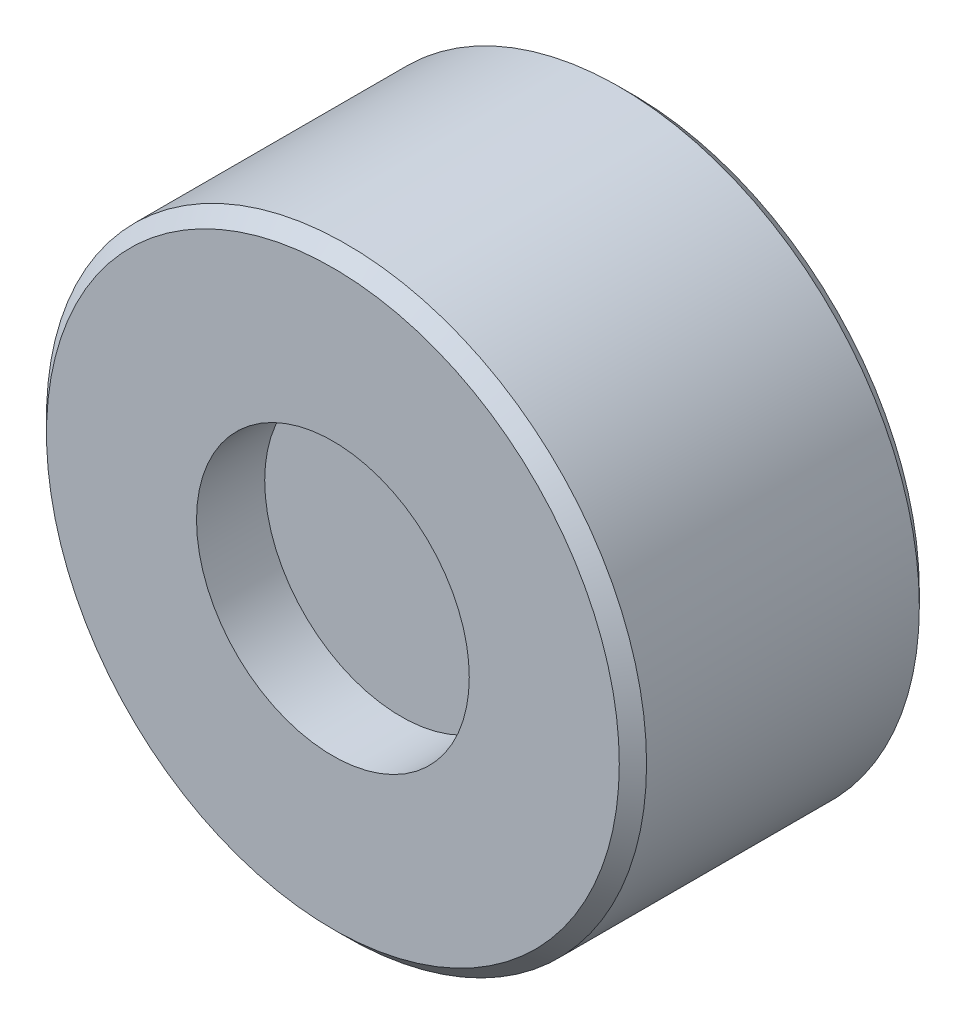
ISO-10303-21;
HEADER;
FILE_DESCRIPTION(('STEP AP214'),'2;1');
FILE_NAME('part.step','',(''),(''),'','','');
FILE_SCHEMA(('AUTOMOTIVE_DESIGN { 1 0 10303 214 1 1 1 1 }'));
ENDSEC;
DATA;
#1=APPLICATION_CONTEXT('core data for automotive mechanical design processes');
#2=APPLICATION_PROTOCOL_DEFINITION('international standard','automotive_design',2000,#1);
#3=PRODUCT_CONTEXT('',#1,'mechanical');
#4=PRODUCT('Part','Part','',(#3));
#5=PRODUCT_RELATED_PRODUCT_CATEGORY('part','',(#4));
#6=PRODUCT_DEFINITION_FORMATION('','',#4);
#7=PRODUCT_DEFINITION_CONTEXT('part definition',#1,'design');
#8=PRODUCT_DEFINITION('design','',#6,#7);
#9=PRODUCT_DEFINITION_SHAPE('','',#8);
#10=(LENGTH_UNIT() NAMED_UNIT(*) SI_UNIT(.MILLI.,.METRE.));
#11=(NAMED_UNIT(*) PLANE_ANGLE_UNIT() SI_UNIT($,.RADIAN.));
#12=(NAMED_UNIT(*) SI_UNIT($,.STERADIAN.) SOLID_ANGLE_UNIT());
#13=UNCERTAINTY_MEASURE_WITH_UNIT(LENGTH_MEASURE(1.E-05),#10,'distance_accuracy_value','');
#14=(GEOMETRIC_REPRESENTATION_CONTEXT(3) GLOBAL_UNCERTAINTY_ASSIGNED_CONTEXT((#13)) GLOBAL_UNIT_ASSIGNED_CONTEXT((#10,
#11,#12)) REPRESENTATION_CONTEXT('',''));
#15=CARTESIAN_POINT('',(0.,0.,0.));
#16=DIRECTION('',(0.,0.,1.));
#17=DIRECTION('',(1.,0.,0.));
#18=AXIS2_PLACEMENT_3D('',#15,#16,#17);
#19=CARTESIAN_POINT('',(0.,0.,22.));
#20=DIRECTION('',(0.,0.,-1.));
#21=DIRECTION('',(-1.,0.,0.));
#22=AXIS2_PLACEMENT_3D('',#19,#20,#21);
#23=CYLINDRICAL_SURFACE('',#22,22.);
#24=CARTESIAN_POINT('',(0.,0.,21.));
#25=DIRECTION('',(0.,0.,1.));
#26=DIRECTION('',(1.,0.,0.));
#27=AXIS2_PLACEMENT_3D('',#24,#25,#26);
#28=CIRCLE('',#27,22.);
#29=CARTESIAN_POINT('',(22.,0.,21.));
#30=VERTEX_POINT('',#29);
#31=EDGE_CURVE('E45',#30,#30,#28,.F.);
#32=ORIENTED_EDGE('',*,*,#31,.T.);
#33=EDGE_LOOP('',(#32));
#34=FACE_BOUND('',#33,.T.);
#35=CARTESIAN_POINT('',(0.,0.,0.999999999999994));
#36=DIRECTION('',(0.,0.,1.));
#37=DIRECTION('',(1.,0.,0.));
#38=AXIS2_PLACEMENT_3D('',#35,#36,#37);
#39=CIRCLE('',#38,22.);
#40=CARTESIAN_POINT('',(22.,0.,0.999999999999994));
#41=VERTEX_POINT('',#40);
#42=EDGE_CURVE('E50',#41,#41,#39,.T.);
#43=ORIENTED_EDGE('',*,*,#42,.T.);
#44=EDGE_LOOP('',(#43));
#45=FACE_BOUND('',#44,.T.);
#46=ADVANCED_FACE('F30',(#34,#45),#23,.T.);
#47=CARTESIAN_POINT('',(0.,0.,22.));
#48=DIRECTION('',(0.,0.,1.));
#49=DIRECTION('',(1.,0.,0.));
#50=AXIS2_PLACEMENT_3D('',#47,#48,#49);
#51=PLANE('',#50);
#52=CARTESIAN_POINT('',(0.,0.,22.));
#53=DIRECTION('',(0.,0.,1.));
#54=DIRECTION('',(1.,0.,0.));
#55=AXIS2_PLACEMENT_3D('',#52,#53,#54);
#56=CIRCLE('',#55,21.);
#57=CARTESIAN_POINT('',(21.,0.,22.));
#58=VERTEX_POINT('',#57);
#59=EDGE_CURVE('E53',#58,#58,#56,.T.);
#60=ORIENTED_EDGE('',*,*,#59,.T.);
#61=EDGE_LOOP('',(#60));
#62=FACE_BOUND('',#61,.T.);
#63=CARTESIAN_POINT('',(0.,0.,22.));
#64=DIRECTION('',(0.,0.,1.));
#65=DIRECTION('',(1.,0.,0.));
#66=AXIS2_PLACEMENT_3D('',#63,#64,#65);
#67=CIRCLE('',#66,10.);
#68=CARTESIAN_POINT('',(10.,0.,22.));
#69=VERTEX_POINT('',#68);
#70=EDGE_CURVE('E57',#69,#69,#67,.T.);
#71=ORIENTED_EDGE('',*,*,#70,.F.);
#72=EDGE_LOOP('',(#71));
#73=FACE_BOUND('',#72,.T.);
#74=ADVANCED_FACE('F72',(#62,#73),#51,.T.);
#75=CARTESIAN_POINT('',(0.,0.,0.));
#76=DIRECTION('',(0.,0.,1.));
#77=DIRECTION('',(1.,0.,0.));
#78=AXIS2_PLACEMENT_3D('',#75,#76,#77);
#79=PLANE('',#78);
#80=CARTESIAN_POINT('',(0.,18.8183021810615,0.));
#81=DIRECTION('',(0.,0.,-1.));
#82=DIRECTION('',(-1.,0.,0.));
#83=AXIS2_PLACEMENT_3D('',#80,#81,#82);
#84=CIRCLE('',#83,0.911044844025388);
#85=CARTESIAN_POINT('',(-0.911044844025388,18.8183021810615,0.));
#86=VERTEX_POINT('',#85);
#87=EDGE_CURVE('E60',#86,#86,#84,.T.);
#88=ORIENTED_EDGE('',*,*,#87,.F.);
#89=EDGE_LOOP('',(#88));
#90=FACE_BOUND('',#89,.T.);
#91=CARTESIAN_POINT('',(0.,0.,0.));
#92=DIRECTION('',(0.,0.,1.));
#93=DIRECTION('',(1.,0.,0.));
#94=AXIS2_PLACEMENT_3D('',#91,#92,#93);
#95=CIRCLE('',#94,21.);
#96=CARTESIAN_POINT('',(21.,0.,0.));
#97=VERTEX_POINT('',#96);
#98=EDGE_CURVE('E41',#97,#97,#95,.F.);
#99=ORIENTED_EDGE('',*,*,#98,.T.);
#100=EDGE_LOOP('',(#99));
#101=FACE_BOUND('',#100,.T.);
#102=ADVANCED_FACE('F68',(#90,#101),#79,.F.);
#103=CARTESIAN_POINT('',(0.,0.,17.));
#104=DIRECTION('',(0.,0.,1.));
#105=DIRECTION('',(1.,0.,0.));
#106=AXIS2_PLACEMENT_3D('',#103,#104,#105);
#107=CYLINDRICAL_SURFACE('',#106,10.);
#108=CARTESIAN_POINT('',(0.,0.,17.));
#109=DIRECTION('',(0.,0.,1.));
#110=DIRECTION('',(1.,0.,0.));
#111=AXIS2_PLACEMENT_3D('',#108,#109,#110);
#112=CIRCLE('',#111,10.);
#113=CARTESIAN_POINT('',(10.,0.,17.));
#114=VERTEX_POINT('',#113);
#115=EDGE_CURVE('E56',#114,#114,#112,.T.);
#116=ORIENTED_EDGE('',*,*,#115,.F.);
#117=EDGE_LOOP('',(#116));
#118=FACE_BOUND('',#117,.T.);
#119=ORIENTED_EDGE('',*,*,#70,.T.);
#120=EDGE_LOOP('',(#119));
#121=FACE_BOUND('',#120,.T.);
#122=ADVANCED_FACE('F71',(#118,#121),#107,.F.);
#123=CARTESIAN_POINT('',(0.,0.,17.));
#124=DIRECTION('',(0.,0.,1.));
#125=DIRECTION('',(1.,0.,0.));
#126=AXIS2_PLACEMENT_3D('',#123,#124,#125);
#127=PLANE('',#126);
#128=ORIENTED_EDGE('',*,*,#115,.T.);
#129=EDGE_LOOP('',(#128));
#130=FACE_BOUND('',#129,.T.);
#131=ADVANCED_FACE('F92',(#130),#127,.T.);
#132=CARTESIAN_POINT('',(0.,0.,22.));
#133=DIRECTION('',(0.,0.,-1.));
#134=DIRECTION('',(-1.,0.,0.));
#135=AXIS2_PLACEMENT_3D('',#132,#133,#134);
#136=CONICAL_SURFACE('',#135,21.,0.785398163397445);
#137=ORIENTED_EDGE('',*,*,#31,.F.);
#138=EDGE_LOOP('',(#137));
#139=FACE_BOUND('',#138,.T.);
#140=ORIENTED_EDGE('',*,*,#59,.F.);
#141=EDGE_LOOP('',(#140));
#142=FACE_BOUND('',#141,.T.);
#143=ADVANCED_FACE('F79',(#139,#142),#136,.T.);
#144=CARTESIAN_POINT('',(0.,0.,0.999999999999994));
#145=DIRECTION('',(0.,0.,1.));
#146=DIRECTION('',(1.,0.,0.));
#147=AXIS2_PLACEMENT_3D('',#144,#145,#146);
#148=CONICAL_SURFACE('',#147,22.,0.785398163397452);
#149=ORIENTED_EDGE('',*,*,#98,.F.);
#150=EDGE_LOOP('',(#149));
#151=FACE_BOUND('',#150,.T.);
#152=ORIENTED_EDGE('',*,*,#42,.F.);
#153=EDGE_LOOP('',(#152));
#154=FACE_BOUND('',#153,.T.);
#155=ADVANCED_FACE('F76',(#151,#154),#148,.T.);
#156=CARTESIAN_POINT('',(0.,18.8183021810615,1.));
#157=DIRECTION('',(0.,0.,-1.));
#158=DIRECTION('',(-1.,0.,0.));
#159=AXIS2_PLACEMENT_3D('',#156,#157,#158);
#160=CYLINDRICAL_SURFACE('',#159,0.911044844025388);
#161=CARTESIAN_POINT('',(0.,18.8183021810615,0.0999999999999867));
#162=DIRECTION('',(0.,0.,-1.));
#163=DIRECTION('',(-1.,0.,0.));
#164=AXIS2_PLACEMENT_3D('',#161,#162,#163);
#165=CIRCLE('',#164,0.911044844025388);
#166=CARTESIAN_POINT('',(-0.911044844025388,18.8183021810615,0.0999999999999868));
#167=VERTEX_POINT('',#166);
#168=EDGE_CURVE('E10',#167,#167,#165,.F.);
#169=ORIENTED_EDGE('',*,*,#168,.T.);
#170=EDGE_LOOP('',(#169));
#171=FACE_BOUND('',#170,.T.);
#172=ORIENTED_EDGE('',*,*,#87,.T.);
#173=EDGE_LOOP('',(#172));
#174=FACE_BOUND('',#173,.T.);
#175=ADVANCED_FACE('F66',(#171,#174),#160,.F.);
#176=CARTESIAN_POINT('',(0.,18.8183021810615,1.));
#177=DIRECTION('',(0.,0.,-1.));
#178=DIRECTION('',(-1.,0.,0.));
#179=AXIS2_PLACEMENT_3D('',#176,#177,#178);
#180=PLANE('',#179);
#181=CARTESIAN_POINT('',(0.,18.8183021810615,1.));
#182=DIRECTION('',(0.,0.,-1.));
#183=DIRECTION('',(-1.,0.,0.));
#184=AXIS2_PLACEMENT_3D('',#181,#182,#183);
#185=CIRCLE('',#184,0.0110448440253651);
#186=CARTESIAN_POINT('',(-0.011044844025365,18.8183021810615,1.));
#187=VERTEX_POINT('',#186);
#188=EDGE_CURVE('E37',#187,#187,#185,.T.);
#189=ORIENTED_EDGE('',*,*,#188,.T.);
#190=EDGE_LOOP('',(#189));
#191=FACE_BOUND('',#190,.T.);
#192=ADVANCED_FACE('F114',(#191),#180,.T.);
#193=CARTESIAN_POINT('',(0.,18.8183021810615,1.));
#194=DIRECTION('',(0.,0.,-1.));
#195=DIRECTION('',(-1.,0.,0.));
#196=AXIS2_PLACEMENT_3D('',#193,#194,#195);
#197=CONICAL_SURFACE('',#196,0.0110448440253651,0.785398163397454);
#198=CARTESIAN_POINT('',(-0.911044844025388,18.8183021810615,0.0999999999999868));
#199=CARTESIAN_POINT('',(-0.901669844025387,18.8183021810615,0.109374999999987));
#200=CARTESIAN_POINT('',(-0.892294844025387,18.8183021810615,0.118749999999987));
#201=CARTESIAN_POINT('',(-0.873544844025387,18.8183021810615,0.137499999999987));
#202=CARTESIAN_POINT('',(-0.864169844025387,18.8183021810615,0.146874999999988));
#203=CARTESIAN_POINT('',(-0.845419844025386,18.8183021810615,0.165624999999988));
#204=CARTESIAN_POINT('',(-0.836044844025386,18.8183021810615,0.174999999999988));
#205=CARTESIAN_POINT('',(-0.817294844025385,18.8183021810615,0.193749999999988));
#206=CARTESIAN_POINT('',(-0.807919844025385,18.8183021810615,0.203124999999988));
#207=CARTESIAN_POINT('',(-0.789169844025385,18.8183021810615,0.221874999999989));
#208=CARTESIAN_POINT('',(-0.779794844025384,18.8183021810615,0.231249999999989));
#209=CARTESIAN_POINT('',(-0.761044844025384,18.8183021810615,0.249999999999989));
#210=CARTESIAN_POINT('',(-0.751669844025384,18.8183021810615,0.259374999999989));
#211=CARTESIAN_POINT('',(-0.732919844025383,18.8183021810615,0.278124999999989));
#212=CARTESIAN_POINT('',(-0.723544844025383,18.8183021810615,0.28749999999999));
#213=CARTESIAN_POINT('',(-0.704794844025383,18.8183021810615,0.30624999999999));
#214=CARTESIAN_POINT('',(-0.695419844025382,18.8183021810615,0.31562499999999));
#215=CARTESIAN_POINT('',(-0.676669844025382,18.8183021810615,0.33437499999999));
#216=CARTESIAN_POINT('',(-0.667294844025382,18.8183021810615,0.34374999999999));
#217=CARTESIAN_POINT('',(-0.648544844025381,18.8183021810615,0.362499999999991));
#218=CARTESIAN_POINT('',(-0.639169844025381,18.8183021810615,0.371874999999991));
#219=CARTESIAN_POINT('',(-0.62041984402538,18.8183021810615,0.390624999999991));
#220=CARTESIAN_POINT('',(-0.61104484402538,18.8183021810615,0.399999999999991));
#221=CARTESIAN_POINT('',(-0.59229484402538,18.8183021810615,0.418749999999992));
#222=CARTESIAN_POINT('',(-0.582919844025379,18.8183021810615,0.428124999999992));
#223=CARTESIAN_POINT('',(-0.564169844025379,18.8183021810615,0.446874999999992));
#224=CARTESIAN_POINT('',(-0.554794844025379,18.8183021810615,0.456249999999992));
#225=CARTESIAN_POINT('',(-0.536044844025378,18.8183021810615,0.474999999999992));
#226=CARTESIAN_POINT('',(-0.526669844025378,18.8183021810615,0.484374999999993));
#227=CARTESIAN_POINT('',(-0.507919844025377,18.8183021810615,0.503124999999993));
#228=CARTESIAN_POINT('',(-0.498544844025377,18.8183021810615,0.512499999999993));
#229=CARTESIAN_POINT('',(-0.479794844025377,18.8183021810615,0.531249999999993));
#230=CARTESIAN_POINT('',(-0.470419844025377,18.8183021810615,0.540624999999993));
#231=CARTESIAN_POINT('',(-0.451669844025376,18.8183021810615,0.559374999999994));
#232=CARTESIAN_POINT('',(-0.442294844025376,18.8183021810615,0.568749999999994));
#233=CARTESIAN_POINT('',(-0.423544844025375,18.8183021810615,0.587499999999994));
#234=CARTESIAN_POINT('',(-0.414169844025375,18.8183021810615,0.596874999999994));
#235=CARTESIAN_POINT('',(-0.395419844025375,18.8183021810615,0.615624999999994));
#236=CARTESIAN_POINT('',(-0.386044844025374,18.8183021810615,0.624999999999995));
#237=CARTESIAN_POINT('',(-0.367294844025374,18.8183021810615,0.643749999999995));
#238=CARTESIAN_POINT('',(-0.357919844025374,18.8183021810615,0.653124999999995));
#239=CARTESIAN_POINT('',(-0.339169844025373,18.8183021810615,0.671874999999995));
#240=CARTESIAN_POINT('',(-0.329794844025373,18.8183021810615,0.681249999999995));
#241=CARTESIAN_POINT('',(-0.311044844025373,18.8183021810615,0.699999999999996));
#242=CARTESIAN_POINT('',(-0.301669844025372,18.8183021810615,0.709374999999996));
#243=CARTESIAN_POINT('',(-0.282919844025372,18.8183021810615,0.728124999999996));
#244=CARTESIAN_POINT('',(-0.273544844025372,18.8183021810615,0.737499999999996));
#245=CARTESIAN_POINT('',(-0.254794844025371,18.8183021810615,0.756249999999997));
#246=CARTESIAN_POINT('',(-0.245419844025371,18.8183021810615,0.765624999999997));
#247=CARTESIAN_POINT('',(-0.22666984402537,18.8183021810615,0.784374999999997));
#248=CARTESIAN_POINT('',(-0.21729484402537,18.8183021810615,0.793749999999997));
#249=CARTESIAN_POINT('',(-0.19854484402537,18.8183021810615,0.812499999999997));
#250=CARTESIAN_POINT('',(-0.189169844025369,18.8183021810615,0.821874999999997));
#251=CARTESIAN_POINT('',(-0.170419844025369,18.8183021810615,0.840624999999998));
#252=CARTESIAN_POINT('',(-0.161044844025369,18.8183021810615,0.849999999999998));
#253=CARTESIAN_POINT('',(-0.142294844025368,18.8183021810615,0.868749999999998));
#254=CARTESIAN_POINT('',(-0.132919844025368,18.8183021810615,0.878124999999998));
#255=CARTESIAN_POINT('',(-0.114169844025368,18.8183021810615,0.896874999999999));
#256=CARTESIAN_POINT('',(-0.104794844025367,18.8183021810615,0.906249999999999));
#257=CARTESIAN_POINT('',(-0.0860448440253669,18.8183021810615,0.924999999999999));
#258=CARTESIAN_POINT('',(-0.0766698440253667,18.8183021810615,0.934374999999999));
#259=CARTESIAN_POINT('',(-0.0579198440253662,18.8183021810615,0.953124999999999));
#260=CARTESIAN_POINT('',(-0.0485448440253659,18.8183021810615,0.9625));
#261=CARTESIAN_POINT('',(-0.0297948440253654,18.8183021810615,0.98125));
#262=CARTESIAN_POINT('',(-0.0204198440253652,18.8183021810615,0.990625));
#263=CARTESIAN_POINT('',(-0.011044844025365,18.8183021810615,1.));
#264=B_SPLINE_CURVE_WITH_KNOTS('',3,(#198,#199,#200,#201,#202,#203,#204,#205,#206,#207,#208,
#209,#210,#211,#212,#213,#214,#215,#216,#217,#218,#219,#220,#221,#222,#223,#224,#225,#226,#227,
#228,#229,#230,#231,#232,#233,#234,#235,#236,#237,#238,#239,#240,#241,#242,#243,#244,#245,#246,
#247,#248,#249,#250,#251,#252,#253,#254,#255,#256,#257,#258,#259,#260,#261,#262,#263),
.UNSPECIFIED.,.F.,.F.,(4,2,2,2,2,2,2,2,2,2,2,2,2,2,2,2,2,2,2,2,2,2,2,2,2,2,2,2,2,2,2,2,4),(0.,
0.0397747564417441,0.0795495128834883,0.119324269325232,0.159099025766976,0.198873782208721,
0.238648538650465,0.278423295092209,0.318198051533953,0.357972807975697,0.397747564417441,
0.437522320859185,0.477297077300929,0.517071833742673,0.556846590184417,0.596621346626162,
0.636396103067906,0.67617085950965,0.715945615951394,0.755720372393138,0.795495128834882,
0.835269885276626,0.87504464171837,0.914819398160114,0.954594154601858,0.994368911043603,
1.03414366748535,1.07391842392709,1.11369318036883,1.15346793681058,1.19324269325232,
1.23301744969407,1.27279220613581),.UNSPECIFIED.);
#265=EDGE_CURVE('BSEAM32',#167,#187,#264,.T.);
#266=ORIENTED_EDGE('',*,*,#168,.F.);
#267=ORIENTED_EDGE('',*,*,#188,.F.);
#268=ORIENTED_EDGE('',*,*,#265,.T.);
#269=ORIENTED_EDGE('',*,*,#265,.F.);
#270=EDGE_LOOP('',(#266,#268,#267,#269));
#271=FACE_BOUND('',#270,.T.);
#272=ADVANCED_FACE('F32',(#271),#197,.F.);
#273=CLOSED_SHELL('',(#46,#74,#102,#122,#131,#143,#155,#175,#192,#272));
#274=MANIFOLD_SOLID_BREP('B2',#273);
#275=ADVANCED_BREP_SHAPE_REPRESENTATION('',(#18,#274),#14);
#276=SHAPE_DEFINITION_REPRESENTATION(#9,#275);
ENDSEC;
END-ISO-10303-21;
